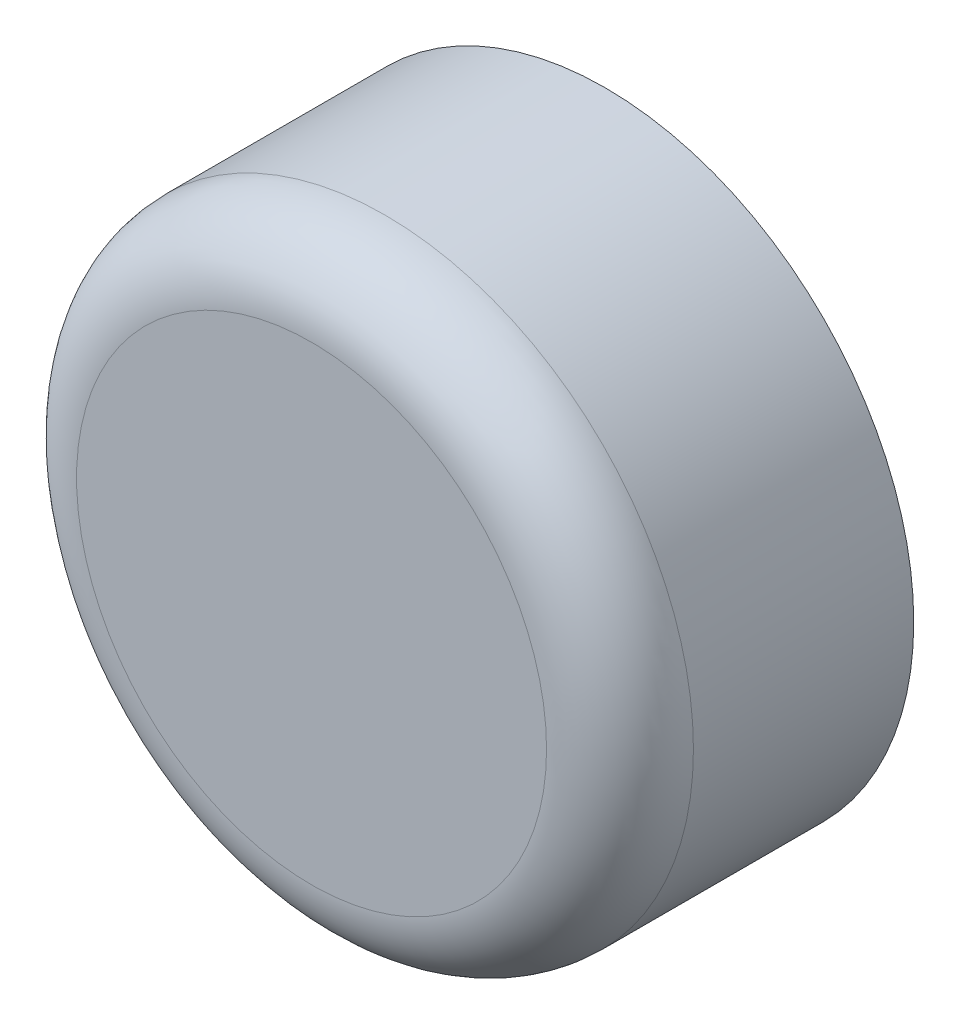
ISO-10303-21;
HEADER;
FILE_DESCRIPTION(('STEP AP214'),'2;1');
FILE_NAME('part.step','',(''),(''),'','','');
FILE_SCHEMA(('AUTOMOTIVE_DESIGN { 1 0 10303 214 1 1 1 1 }'));
ENDSEC;
DATA;
#1=APPLICATION_CONTEXT('core data for automotive mechanical design processes');
#2=APPLICATION_PROTOCOL_DEFINITION('international standard','automotive_design',2000,#1);
#3=PRODUCT_CONTEXT('',#1,'mechanical');
#4=PRODUCT('Part','Part','',(#3));
#5=PRODUCT_RELATED_PRODUCT_CATEGORY('part','',(#4));
#6=PRODUCT_DEFINITION_FORMATION('','',#4);
#7=PRODUCT_DEFINITION_CONTEXT('part definition',#1,'design');
#8=PRODUCT_DEFINITION('design','',#6,#7);
#9=PRODUCT_DEFINITION_SHAPE('','',#8);
#10=(LENGTH_UNIT() NAMED_UNIT(*) SI_UNIT(.MILLI.,.METRE.));
#11=(NAMED_UNIT(*) PLANE_ANGLE_UNIT() SI_UNIT($,.RADIAN.));
#12=(NAMED_UNIT(*) SI_UNIT($,.STERADIAN.) SOLID_ANGLE_UNIT());
#13=UNCERTAINTY_MEASURE_WITH_UNIT(LENGTH_MEASURE(1.E-05),#10,'distance_accuracy_value','');
#14=(GEOMETRIC_REPRESENTATION_CONTEXT(3) GLOBAL_UNCERTAINTY_ASSIGNED_CONTEXT((#13)) GLOBAL_UNIT_ASSIGNED_CONTEXT((#10,
#11,#12)) REPRESENTATION_CONTEXT('',''));
#15=CARTESIAN_POINT('',(0.,0.,0.));
#16=DIRECTION('',(0.,0.,1.));
#17=DIRECTION('',(1.,0.,0.));
#18=AXIS2_PLACEMENT_3D('',#15,#16,#17);
#19=CARTESIAN_POINT('',(0.,0.,25.4));
#20=DIRECTION('',(0.,0.,1.));
#21=DIRECTION('',(1.,0.,0.));
#22=AXIS2_PLACEMENT_3D('',#19,#20,#21);
#23=PLANE('',#22);
#24=CARTESIAN_POINT('',(0.,0.,25.4));
#25=DIRECTION('',(0.,0.,-1.));
#26=DIRECTION('',(1.,0.,0.));
#27=AXIS2_PLACEMENT_3D('',#24,#25,#26);
#28=CIRCLE('',#27,1.6);
#29=CARTESIAN_POINT('',(1.6,0.,25.4));
#30=VERTEX_POINT('',#29);
#31=EDGE_CURVE('E25',#30,#30,#28,.T.);
#32=ORIENTED_EDGE('',*,*,#31,.F.);
#33=EDGE_LOOP('',(#32));
#34=FACE_BOUND('',#33,.T.);
#35=ADVANCED_FACE('F14',(#34),#23,.T.);
#36=CARTESIAN_POINT('',(0.,0.,24.9));
#37=DIRECTION('',(0.,0.,1.));
#38=DIRECTION('',(1.,0.,0.));
#39=AXIS2_PLACEMENT_3D('',#36,#37,#38);
#40=TOROIDAL_SURFACE('',#39,1.6,0.5);
#41=CARTESIAN_POINT('',(0.,0.,24.9));
#42=DIRECTION('',(0.,0.,1.));
#43=DIRECTION('',(1.,0.,0.));
#44=AXIS2_PLACEMENT_3D('',#41,#42,#43);
#45=CIRCLE('',#44,2.1);
#46=CARTESIAN_POINT('',(2.1,0.,24.9));
#47=VERTEX_POINT('',#46);
#48=EDGE_CURVE('E21',#47,#47,#45,.F.);
#49=ORIENTED_EDGE('',*,*,#48,.F.);
#50=EDGE_LOOP('',(#49));
#51=FACE_BOUND('',#50,.T.);
#52=ORIENTED_EDGE('',*,*,#31,.T.);
#53=EDGE_LOOP('',(#52));
#54=FACE_BOUND('',#53,.T.);
#55=ADVANCED_FACE('F35',(#51,#54),#40,.T.);
#56=CARTESIAN_POINT('',(0.,0.,23.4));
#57=DIRECTION('',(0.,0.,1.));
#58=DIRECTION('',(1.,0.,0.));
#59=AXIS2_PLACEMENT_3D('',#56,#57,#58);
#60=PLANE('',#59);
#61=CARTESIAN_POINT('',(0.,0.,23.4));
#62=DIRECTION('',(0.,0.,1.));
#63=DIRECTION('',(1.,0.,0.));
#64=AXIS2_PLACEMENT_3D('',#61,#62,#63);
#65=CIRCLE('',#64,2.1);
#66=CARTESIAN_POINT('',(2.1,0.,23.4));
#67=VERTEX_POINT('',#66);
#68=EDGE_CURVE('E9',#67,#67,#65,.T.);
#69=ORIENTED_EDGE('',*,*,#68,.F.);
#70=EDGE_LOOP('',(#69));
#71=FACE_BOUND('',#70,.T.);
#72=ADVANCED_FACE('F39',(#71),#60,.F.);
#73=CARTESIAN_POINT('',(0.,0.,23.4));
#74=DIRECTION('',(0.,0.,1.));
#75=DIRECTION('',(1.,0.,0.));
#76=AXIS2_PLACEMENT_3D('',#73,#74,#75);
#77=CYLINDRICAL_SURFACE('',#76,2.1);
#78=ORIENTED_EDGE('',*,*,#48,.T.);
#79=EDGE_LOOP('',(#78));
#80=FACE_BOUND('',#79,.T.);
#81=ORIENTED_EDGE('',*,*,#68,.T.);
#82=EDGE_LOOP('',(#81));
#83=FACE_BOUND('',#82,.T.);
#84=ADVANCED_FACE('F63',(#80,#83),#77,.T.);
#85=CLOSED_SHELL('',(#35,#55,#72,#84));
#86=MANIFOLD_SOLID_BREP('B1',#85);
#87=ADVANCED_BREP_SHAPE_REPRESENTATION('',(#18,#86),#14);
#88=SHAPE_DEFINITION_REPRESENTATION(#9,#87);
ENDSEC;
END-ISO-10303-21;
